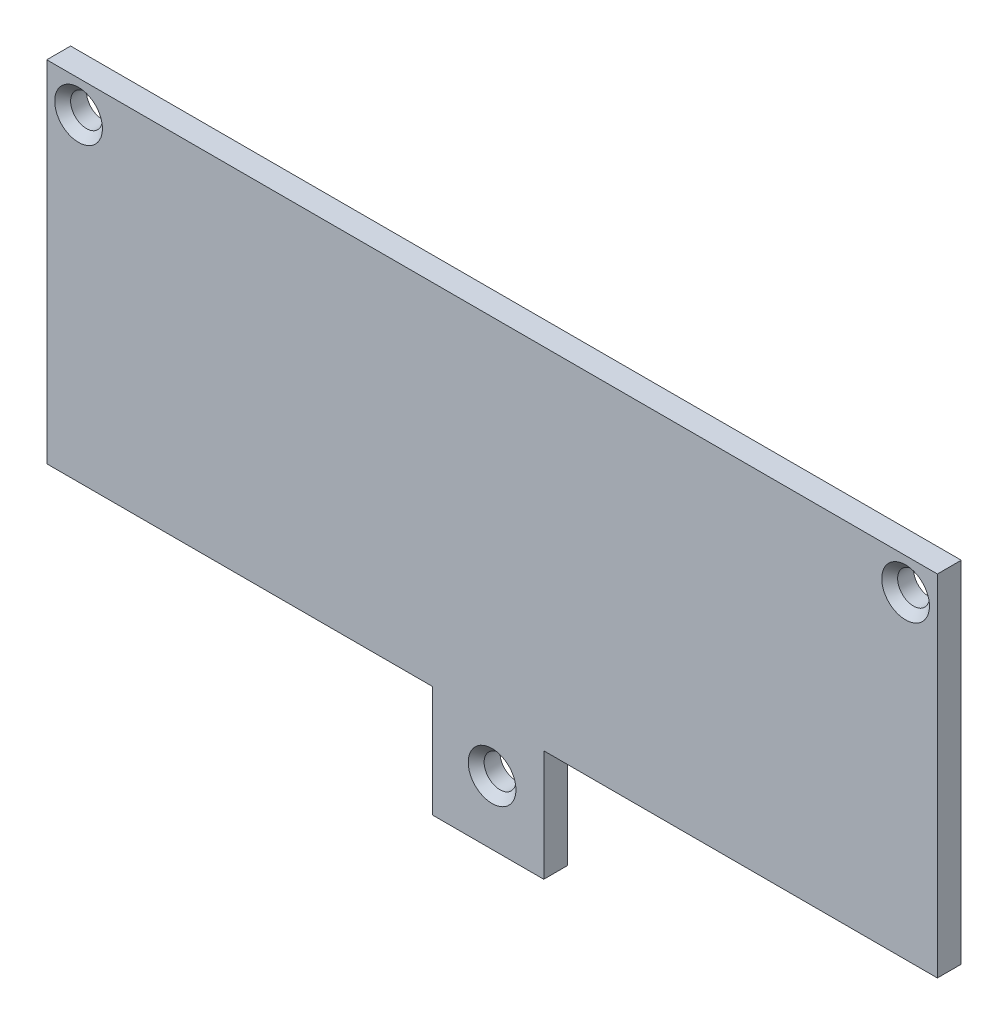
ISO-10303-21;
HEADER;
FILE_DESCRIPTION(('STEP AP214'),'2;1');
FILE_NAME('part.step','',(''),(''),'','','');
FILE_SCHEMA(('AUTOMOTIVE_DESIGN { 1 0 10303 214 1 1 1 1 }'));
ENDSEC;
DATA;
#1=APPLICATION_CONTEXT('core data for automotive mechanical design processes');
#2=APPLICATION_PROTOCOL_DEFINITION('international standard','automotive_design',2000,#1);
#3=PRODUCT_CONTEXT('',#1,'mechanical');
#4=PRODUCT('Part','Part','',(#3));
#5=PRODUCT_RELATED_PRODUCT_CATEGORY('part','',(#4));
#6=PRODUCT_DEFINITION_FORMATION('','',#4);
#7=PRODUCT_DEFINITION_CONTEXT('part definition',#1,'design');
#8=PRODUCT_DEFINITION('design','',#6,#7);
#9=PRODUCT_DEFINITION_SHAPE('','',#8);
#10=(LENGTH_UNIT() NAMED_UNIT(*) SI_UNIT(.MILLI.,.METRE.));
#11=(NAMED_UNIT(*) PLANE_ANGLE_UNIT() SI_UNIT($,.RADIAN.));
#12=(NAMED_UNIT(*) SI_UNIT($,.STERADIAN.) SOLID_ANGLE_UNIT());
#13=UNCERTAINTY_MEASURE_WITH_UNIT(LENGTH_MEASURE(1.E-05),#10,'distance_accuracy_value','');
#14=(GEOMETRIC_REPRESENTATION_CONTEXT(3) GLOBAL_UNCERTAINTY_ASSIGNED_CONTEXT((#13)) GLOBAL_UNIT_ASSIGNED_CONTEXT((#10,
#11,#12)) REPRESENTATION_CONTEXT('',''));
#15=CARTESIAN_POINT('',(0.,0.,0.));
#16=DIRECTION('',(0.,0.,1.));
#17=DIRECTION('',(1.,0.,0.));
#18=AXIS2_PLACEMENT_3D('',#15,#16,#17);
#19=CARTESIAN_POINT('',(0.,0.,1.5));
#20=DIRECTION('',(0.,1.,0.));
#21=DIRECTION('',(-1.,0.,0.));
#22=AXIS2_PLACEMENT_3D('',#19,#20,#21);
#23=PLANE('',#22);
#24=DIRECTION('',(1.,0.,0.));
#25=VECTOR('',#24,1.);
#26=CARTESIAN_POINT('',(0.,0.,1.5));
#27=LINE('',#26,#25);
#28=CARTESIAN_POINT('',(3.,0.,1.5));
#29=VERTEX_POINT('',#28);
#30=CARTESIAN_POINT('',(48.,0.,1.5));
#31=VERTEX_POINT('',#30);
#32=EDGE_CURVE('E226',#29,#31,#27,.T.);
#33=ORIENTED_EDGE('',*,*,#32,.F.);
#34=DIRECTION('',(0.,0.,-1.));
#35=VECTOR('',#34,1.);
#36=CARTESIAN_POINT('',(3.,0.,0.));
#37=LINE('',#36,#35);
#38=CARTESIAN_POINT('',(3.,0.,0.));
#39=VERTEX_POINT('',#38);
#40=EDGE_CURVE('E266',#29,#39,#37,.T.);
#41=ORIENTED_EDGE('',*,*,#40,.T.);
#42=DIRECTION('',(1.,0.,0.));
#43=VECTOR('',#42,1.);
#44=CARTESIAN_POINT('',(0.,0.,0.));
#45=LINE('',#44,#43);
#46=CARTESIAN_POINT('',(48.,0.,0.));
#47=VERTEX_POINT('',#46);
#48=EDGE_CURVE('E170',#39,#47,#45,.T.);
#49=ORIENTED_EDGE('',*,*,#48,.T.);
#50=DIRECTION('',(0.,0.,-1.));
#51=VECTOR('',#50,1.);
#52=CARTESIAN_POINT('',(48.,0.,1.5));
#53=LINE('',#52,#51);
#54=EDGE_CURVE('E264',#47,#31,#53,.F.);
#55=ORIENTED_EDGE('',*,*,#54,.T.);
#56=EDGE_LOOP('',(#33,#41,#49,#55));
#57=FACE_BOUND('',#56,.T.);
#58=ADVANCED_FACE('F37',(#57),#23,.F.);
#59=CARTESIAN_POINT('',(51.,0.,1.5));
#60=DIRECTION('',(-1.,0.,0.));
#61=DIRECTION('',(0.,-1.,0.));
#62=AXIS2_PLACEMENT_3D('',#59,#60,#61);
#63=PLANE('',#62);
#64=DIRECTION('',(0.,1.,0.));
#65=VECTOR('',#64,1.);
#66=CARTESIAN_POINT('',(51.,0.,1.5));
#67=LINE('',#66,#65);
#68=CARTESIAN_POINT('',(51.,3.,1.5));
#69=VERTEX_POINT('',#68);
#70=CARTESIAN_POINT('',(51.,13.,1.5));
#71=VERTEX_POINT('',#70);
#72=EDGE_CURVE('E228',#69,#71,#67,.T.);
#73=ORIENTED_EDGE('',*,*,#72,.F.);
#74=DIRECTION('',(0.,0.,-1.));
#75=VECTOR('',#74,1.);
#76=CARTESIAN_POINT('',(51.,3.,1.5));
#77=LINE('',#76,#75);
#78=CARTESIAN_POINT('',(51.,3.,0.));
#79=VERTEX_POINT('',#78);
#80=EDGE_CURVE('E270',#69,#79,#77,.T.);
#81=ORIENTED_EDGE('',*,*,#80,.T.);
#82=DIRECTION('',(0.,1.,0.));
#83=VECTOR('',#82,1.);
#84=CARTESIAN_POINT('',(51.,0.,0.));
#85=LINE('',#84,#83);
#86=CARTESIAN_POINT('',(51.,13.,0.));
#87=VERTEX_POINT('',#86);
#88=EDGE_CURVE('E240',#79,#87,#85,.T.);
#89=ORIENTED_EDGE('',*,*,#88,.T.);
#90=DIRECTION('',(0.,0.,-1.));
#91=VECTOR('',#90,1.);
#92=CARTESIAN_POINT('',(51.,13.,1.5));
#93=LINE('',#92,#91);
#94=EDGE_CURVE('E54',#87,#71,#93,.F.);
#95=ORIENTED_EDGE('',*,*,#94,.T.);
#96=EDGE_LOOP('',(#73,#81,#89,#95));
#97=FACE_BOUND('',#96,.T.);
#98=ADVANCED_FACE('F329',(#97),#63,.F.);
#99=CARTESIAN_POINT('',(0.,16.,1.5));
#100=DIRECTION('',(0.,1.,0.));
#101=DIRECTION('',(-1.,0.,0.));
#102=AXIS2_PLACEMENT_3D('',#99,#100,#101);
#103=PLANE('',#102);
#104=DIRECTION('',(1.,0.,0.));
#105=VECTOR('',#104,1.);
#106=CARTESIAN_POINT('',(0.,16.,0.));
#107=LINE('',#106,#105);
#108=CARTESIAN_POINT('',(3.00000000000001,16.,0.));
#109=VERTEX_POINT('',#108);
#110=CARTESIAN_POINT('',(48.,16.,0.));
#111=VERTEX_POINT('',#110);
#112=EDGE_CURVE('E242',#109,#111,#107,.T.);
#113=ORIENTED_EDGE('',*,*,#112,.F.);
#114=DIRECTION('',(0.,0.,-1.));
#115=VECTOR('',#114,1.);
#116=CARTESIAN_POINT('',(3.00000000000001,16.,1.5));
#117=LINE('',#116,#115);
#118=CARTESIAN_POINT('',(3.00000000000001,16.,1.5));
#119=VERTEX_POINT('',#118);
#120=EDGE_CURVE('E262',#109,#119,#117,.F.);
#121=ORIENTED_EDGE('',*,*,#120,.T.);
#122=DIRECTION('',(1.,0.,0.));
#123=VECTOR('',#122,1.);
#124=CARTESIAN_POINT('',(0.,16.,1.5));
#125=LINE('',#124,#123);
#126=CARTESIAN_POINT('',(48.,16.,1.5));
#127=VERTEX_POINT('',#126);
#128=EDGE_CURVE('E231',#119,#127,#125,.T.);
#129=ORIENTED_EDGE('',*,*,#128,.T.);
#130=DIRECTION('',(0.,0.,-1.));
#131=VECTOR('',#130,1.);
#132=CARTESIAN_POINT('',(48.,16.,0.));
#133=LINE('',#132,#131);
#134=EDGE_CURVE('E259',#127,#111,#133,.T.);
#135=ORIENTED_EDGE('',*,*,#134,.T.);
#136=EDGE_LOOP('',(#113,#121,#129,#135));
#137=FACE_BOUND('',#136,.T.);
#138=ADVANCED_FACE('F335',(#137),#103,.T.);
#139=CARTESIAN_POINT('',(0.,0.,1.5));
#140=DIRECTION('',(-1.,0.,0.));
#141=DIRECTION('',(0.,-1.,0.));
#142=AXIS2_PLACEMENT_3D('',#139,#140,#141);
#143=PLANE('',#142);
#144=DIRECTION('',(0.,1.,0.));
#145=VECTOR('',#144,1.);
#146=CARTESIAN_POINT('',(0.,0.,1.5));
#147=LINE('',#146,#145);
#148=CARTESIAN_POINT('',(0.,3.,1.5));
#149=VERTEX_POINT('',#148);
#150=CARTESIAN_POINT('',(0.,13.,1.5));
#151=VERTEX_POINT('',#150);
#152=EDGE_CURVE('E234',#149,#151,#147,.T.);
#153=ORIENTED_EDGE('',*,*,#152,.T.);
#154=DIRECTION('',(0.,0.,-1.));
#155=VECTOR('',#154,1.);
#156=CARTESIAN_POINT('',(0.,13.,1.5));
#157=LINE('',#156,#155);
#158=CARTESIAN_POINT('',(0.,13.,0.));
#159=VERTEX_POINT('',#158);
#160=EDGE_CURVE('E248',#151,#159,#157,.T.);
#161=ORIENTED_EDGE('',*,*,#160,.T.);
#162=DIRECTION('',(0.,1.,0.));
#163=VECTOR('',#162,1.);
#164=CARTESIAN_POINT('',(0.,0.,0.));
#165=LINE('',#164,#163);
#166=CARTESIAN_POINT('',(0.,3.,0.));
#167=VERTEX_POINT('',#166);
#168=EDGE_CURVE('E229',#167,#159,#165,.T.);
#169=ORIENTED_EDGE('',*,*,#168,.F.);
#170=DIRECTION('',(0.,0.,-1.));
#171=VECTOR('',#170,1.);
#172=CARTESIAN_POINT('',(0.,3.,1.5));
#173=LINE('',#172,#171);
#174=EDGE_CURVE('E237',#167,#149,#173,.F.);
#175=ORIENTED_EDGE('',*,*,#174,.T.);
#176=EDGE_LOOP('',(#153,#161,#169,#175));
#177=FACE_BOUND('',#176,.T.);
#178=ADVANCED_FACE('F367',(#177),#143,.T.);
#179=CARTESIAN_POINT('',(0.,0.,0.));
#180=DIRECTION('',(0.,0.,1.));
#181=DIRECTION('',(1.,0.,0.));
#182=AXIS2_PLACEMENT_3D('',#179,#180,#181);
#183=PLANE('',#182);
#184=ORIENTED_EDGE('',*,*,#168,.T.);
#185=CARTESIAN_POINT('',(3.00000000000001,13.,0.));
#186=DIRECTION('',(0.,0.,1.));
#187=DIRECTION('',(1.,0.,0.));
#188=AXIS2_PLACEMENT_3D('',#185,#186,#187);
#189=CIRCLE('',#188,3.);
#190=EDGE_CURVE('E257',#159,#109,#189,.F.);
#191=ORIENTED_EDGE('',*,*,#190,.T.);
#192=ORIENTED_EDGE('',*,*,#112,.T.);
#193=CARTESIAN_POINT('',(48.,13.,0.));
#194=DIRECTION('',(0.,0.,1.));
#195=DIRECTION('',(1.,0.,0.));
#196=AXIS2_PLACEMENT_3D('',#193,#194,#195);
#197=CIRCLE('',#196,3.);
#198=EDGE_CURVE('E251',#111,#87,#197,.F.);
#199=ORIENTED_EDGE('',*,*,#198,.T.);
#200=ORIENTED_EDGE('',*,*,#88,.F.);
#201=CARTESIAN_POINT('',(48.,3.00000000000001,0.));
#202=DIRECTION('',(0.,0.,1.));
#203=DIRECTION('',(1.,0.,0.));
#204=AXIS2_PLACEMENT_3D('',#201,#202,#203);
#205=CIRCLE('',#204,3.);
#206=EDGE_CURVE('E253',#79,#47,#205,.F.);
#207=ORIENTED_EDGE('',*,*,#206,.T.);
#208=ORIENTED_EDGE('',*,*,#48,.F.);
#209=CARTESIAN_POINT('',(3.,3.,0.));
#210=DIRECTION('',(0.,0.,1.));
#211=DIRECTION('',(1.,0.,0.));
#212=AXIS2_PLACEMENT_3D('',#209,#210,#211);
#213=CIRCLE('',#212,3.);
#214=EDGE_CURVE('E255',#39,#167,#213,.F.);
#215=ORIENTED_EDGE('',*,*,#214,.T.);
#216=EDGE_LOOP('',(#184,#191,#192,#199,#200,#207,#208,#215));
#217=FACE_BOUND('',#216,.T.);
#218=ADVANCED_FACE('F353',(#217),#183,.F.);
#219=CARTESIAN_POINT('',(0.,0.,1.5));
#220=DIRECTION('',(0.,0.,1.));
#221=DIRECTION('',(1.,0.,0.));
#222=AXIS2_PLACEMENT_3D('',#219,#220,#221);
#223=PLANE('',#222);
#224=CARTESIAN_POINT('',(25.5,-5.,1.5));
#225=DIRECTION('',(0.,0.,1.));
#226=DIRECTION('',(1.,0.,0.));
#227=AXIS2_PLACEMENT_3D('',#224,#225,#226);
#228=CIRCLE('',#227,0.999999999999999);
#229=CARTESIAN_POINT('',(26.5,-5.,1.5));
#230=VERTEX_POINT('',#229);
#231=EDGE_CURVE('E41',#230,#230,#228,.T.);
#232=ORIENTED_EDGE('',*,*,#231,.T.);
#233=EDGE_LOOP('',(#232));
#234=FACE_BOUND('',#233,.T.);
#235=CARTESIAN_POINT('',(-0.5,18.,1.5));
#236=DIRECTION('',(0.,0.,1.));
#237=DIRECTION('',(1.,0.,0.));
#238=AXIS2_PLACEMENT_3D('',#235,#236,#237);
#239=CIRCLE('',#238,0.999999999999999);
#240=CARTESIAN_POINT('',(0.499999999999999,18.,1.5));
#241=VERTEX_POINT('',#240);
#242=EDGE_CURVE('E280',#241,#241,#239,.T.);
#243=ORIENTED_EDGE('',*,*,#242,.T.);
#244=EDGE_LOOP('',(#243));
#245=FACE_BOUND('',#244,.T.);
#246=CARTESIAN_POINT('',(51.5,18.,1.5));
#247=DIRECTION('',(0.,0.,1.));
#248=DIRECTION('',(1.,0.,0.));
#249=AXIS2_PLACEMENT_3D('',#246,#247,#248);
#250=CIRCLE('',#249,1.);
#251=CARTESIAN_POINT('',(52.5,18.,1.5));
#252=VERTEX_POINT('',#251);
#253=EDGE_CURVE('E193',#252,#252,#250,.T.);
#254=ORIENTED_EDGE('',*,*,#253,.T.);
#255=EDGE_LOOP('',(#254));
#256=FACE_BOUND('',#255,.T.);
#257=DIRECTION('',(0.,-1.,0.));
#258=VECTOR('',#257,1.);
#259=CARTESIAN_POINT('',(-2.5,19.5,1.5));
#260=LINE('',#259,#258);
#261=CARTESIAN_POINT('',(-2.5,20.,1.5));
#262=VERTEX_POINT('',#261);
#263=CARTESIAN_POINT('',(-2.5,-2.,1.5));
#264=VERTEX_POINT('',#263);
#265=EDGE_CURVE('E167',#262,#264,#260,.T.);
#266=ORIENTED_EDGE('',*,*,#265,.F.);
#267=DIRECTION('',(-1.,0.,0.));
#268=VECTOR('',#267,1.);
#269=CARTESIAN_POINT('',(3.5,20.,1.5));
#270=LINE('',#269,#268);
#271=CARTESIAN_POINT('',(53.5,20.,1.5));
#272=VERTEX_POINT('',#271);
#273=EDGE_CURVE('E162',#272,#262,#270,.T.);
#274=ORIENTED_EDGE('',*,*,#273,.F.);
#275=DIRECTION('',(0.,1.,0.));
#276=VECTOR('',#275,1.);
#277=CARTESIAN_POINT('',(53.5,19.5,1.5));
#278=LINE('',#277,#276);
#279=CARTESIAN_POINT('',(53.5,-2.,1.5));
#280=VERTEX_POINT('',#279);
#281=EDGE_CURVE('E204',#280,#272,#278,.T.);
#282=ORIENTED_EDGE('',*,*,#281,.F.);
#283=DIRECTION('',(1.,0.,0.));
#284=VECTOR('',#283,1.);
#285=CARTESIAN_POINT('',(28.75,-2.,1.5));
#286=LINE('',#285,#284);
#287=CARTESIAN_POINT('',(28.75,-2.,1.5));
#288=VERTEX_POINT('',#287);
#289=EDGE_CURVE('E201',#288,#280,#286,.T.);
#290=ORIENTED_EDGE('',*,*,#289,.F.);
#291=DIRECTION('',(0.,1.,0.));
#292=VECTOR('',#291,1.);
#293=CARTESIAN_POINT('',(28.75,-2.,1.5));
#294=LINE('',#293,#292);
#295=CARTESIAN_POINT('',(28.75,-9.,1.5));
#296=VERTEX_POINT('',#295);
#297=EDGE_CURVE('E199',#296,#288,#294,.T.);
#298=ORIENTED_EDGE('',*,*,#297,.F.);
#299=DIRECTION('',(1.,0.,0.));
#300=VECTOR('',#299,1.);
#301=CARTESIAN_POINT('',(21.75,-9.,1.5));
#302=LINE('',#301,#300);
#303=CARTESIAN_POINT('',(21.75,-9.,1.5));
#304=VERTEX_POINT('',#303);
#305=EDGE_CURVE('E197',#304,#296,#302,.T.);
#306=ORIENTED_EDGE('',*,*,#305,.F.);
#307=DIRECTION('',(0.,-1.,0.));
#308=VECTOR('',#307,1.);
#309=CARTESIAN_POINT('',(21.75,-2.,1.5));
#310=LINE('',#309,#308);
#311=CARTESIAN_POINT('',(21.75,-2.,1.5));
#312=VERTEX_POINT('',#311);
#313=EDGE_CURVE('E195',#312,#304,#310,.T.);
#314=ORIENTED_EDGE('',*,*,#313,.F.);
#315=DIRECTION('',(1.,0.,0.));
#316=VECTOR('',#315,1.);
#317=CARTESIAN_POINT('',(-2.5,-2.,1.5));
#318=LINE('',#317,#316);
#319=EDGE_CURVE('E192',#264,#312,#318,.T.);
#320=ORIENTED_EDGE('',*,*,#319,.F.);
#321=EDGE_LOOP('',(#266,#274,#282,#290,#298,#306,#314,#320));
#322=FACE_BOUND('',#321,.T.);
#323=ORIENTED_EDGE('',*,*,#152,.F.);
#324=CARTESIAN_POINT('',(3.,3.,1.5));
#325=DIRECTION('',(0.,0.,1.));
#326=DIRECTION('',(1.,0.,0.));
#327=AXIS2_PLACEMENT_3D('',#324,#325,#326);
#328=CIRCLE('',#327,3.);
#329=EDGE_CURVE('E275',#149,#29,#328,.T.);
#330=ORIENTED_EDGE('',*,*,#329,.T.);
#331=ORIENTED_EDGE('',*,*,#32,.T.);
#332=CARTESIAN_POINT('',(48.,3.00000000000001,1.5));
#333=DIRECTION('',(0.,0.,1.));
#334=DIRECTION('',(1.,0.,0.));
#335=AXIS2_PLACEMENT_3D('',#332,#333,#334);
#336=CIRCLE('',#335,3.);
#337=EDGE_CURVE('E46',#31,#69,#336,.T.);
#338=ORIENTED_EDGE('',*,*,#337,.T.);
#339=ORIENTED_EDGE('',*,*,#72,.T.);
#340=CARTESIAN_POINT('',(48.,13.,1.5));
#341=DIRECTION('',(0.,0.,1.));
#342=DIRECTION('',(1.,0.,0.));
#343=AXIS2_PLACEMENT_3D('',#340,#341,#342);
#344=CIRCLE('',#343,3.);
#345=EDGE_CURVE('E11',#71,#127,#344,.T.);
#346=ORIENTED_EDGE('',*,*,#345,.T.);
#347=ORIENTED_EDGE('',*,*,#128,.F.);
#348=CARTESIAN_POINT('',(3.00000000000001,13.,1.5));
#349=DIRECTION('',(0.,0.,1.));
#350=DIRECTION('',(1.,0.,0.));
#351=AXIS2_PLACEMENT_3D('',#348,#349,#350);
#352=CIRCLE('',#351,3.);
#353=EDGE_CURVE('E273',#119,#151,#352,.T.);
#354=ORIENTED_EDGE('',*,*,#353,.T.);
#355=EDGE_LOOP('',(#323,#330,#331,#338,#339,#346,#347,#354));
#356=FACE_BOUND('',#355,.T.);
#357=ADVANCED_FACE('F363',(#234,#245,#256,#322,#356),#223,.F.);
#358=CARTESIAN_POINT('',(-2.5,19.5,3.));
#359=DIRECTION('',(1.,0.,0.));
#360=DIRECTION('',(0.,1.,0.));
#361=AXIS2_PLACEMENT_3D('',#358,#359,#360);
#362=PLANE('',#361);
#363=ORIENTED_EDGE('',*,*,#265,.T.);
#364=DIRECTION('',(0.,0.,-1.));
#365=VECTOR('',#364,1.);
#366=CARTESIAN_POINT('',(-2.5,-2.,3.));
#367=LINE('',#366,#365);
#368=CARTESIAN_POINT('',(-2.5,-2.,3.));
#369=VERTEX_POINT('',#368);
#370=EDGE_CURVE('E165',#369,#264,#367,.T.);
#371=ORIENTED_EDGE('',*,*,#370,.F.);
#372=DIRECTION('',(0.,-1.,0.));
#373=VECTOR('',#372,1.);
#374=CARTESIAN_POINT('',(-2.5,19.5,3.));
#375=LINE('',#374,#373);
#376=CARTESIAN_POINT('',(-2.5,20.,3.));
#377=VERTEX_POINT('',#376);
#378=EDGE_CURVE('E151',#377,#369,#375,.T.);
#379=ORIENTED_EDGE('',*,*,#378,.F.);
#380=DIRECTION('',(0.,0.,-1.));
#381=VECTOR('',#380,1.);
#382=CARTESIAN_POINT('',(-2.5,20.,3.));
#383=LINE('',#382,#381);
#384=EDGE_CURVE('E190',#377,#262,#383,.T.);
#385=ORIENTED_EDGE('',*,*,#384,.T.);
#386=EDGE_LOOP('',(#363,#371,#379,#385));
#387=FACE_BOUND('',#386,.T.);
#388=ADVANCED_FACE('F166',(#387),#362,.F.);
#389=CARTESIAN_POINT('',(-2.5,-2.,3.));
#390=DIRECTION('',(0.,1.,0.));
#391=DIRECTION('',(0.,0.,1.));
#392=AXIS2_PLACEMENT_3D('',#389,#390,#391);
#393=PLANE('',#392);
#394=ORIENTED_EDGE('',*,*,#319,.T.);
#395=DIRECTION('',(0.,0.,-1.));
#396=VECTOR('',#395,1.);
#397=CARTESIAN_POINT('',(21.75,-2.,3.));
#398=LINE('',#397,#396);
#399=CARTESIAN_POINT('',(21.75,-2.,3.));
#400=VERTEX_POINT('',#399);
#401=EDGE_CURVE('E171',#400,#312,#398,.T.);
#402=ORIENTED_EDGE('',*,*,#401,.F.);
#403=DIRECTION('',(1.,0.,0.));
#404=VECTOR('',#403,1.);
#405=CARTESIAN_POINT('',(-2.5,-2.,3.));
#406=LINE('',#405,#404);
#407=EDGE_CURVE('E155',#369,#400,#406,.T.);
#408=ORIENTED_EDGE('',*,*,#407,.F.);
#409=ORIENTED_EDGE('',*,*,#370,.T.);
#410=EDGE_LOOP('',(#394,#402,#408,#409));
#411=FACE_BOUND('',#410,.T.);
#412=ADVANCED_FACE('F173',(#411),#393,.F.);
#413=CARTESIAN_POINT('',(21.75,-2.,3.));
#414=DIRECTION('',(1.,0.,0.));
#415=DIRECTION('',(0.,0.,-1.));
#416=AXIS2_PLACEMENT_3D('',#413,#414,#415);
#417=PLANE('',#416);
#418=ORIENTED_EDGE('',*,*,#313,.T.);
#419=DIRECTION('',(0.,0.,-1.));
#420=VECTOR('',#419,1.);
#421=CARTESIAN_POINT('',(21.75,-9.,3.));
#422=LINE('',#421,#420);
#423=CARTESIAN_POINT('',(21.75,-9.,3.));
#424=VERTEX_POINT('',#423);
#425=EDGE_CURVE('E222',#424,#304,#422,.T.);
#426=ORIENTED_EDGE('',*,*,#425,.F.);
#427=DIRECTION('',(0.,-1.,0.));
#428=VECTOR('',#427,1.);
#429=CARTESIAN_POINT('',(21.75,-2.,3.));
#430=LINE('',#429,#428);
#431=EDGE_CURVE('E176',#400,#424,#430,.T.);
#432=ORIENTED_EDGE('',*,*,#431,.F.);
#433=ORIENTED_EDGE('',*,*,#401,.T.);
#434=EDGE_LOOP('',(#418,#426,#432,#433));
#435=FACE_BOUND('',#434,.T.);
#436=ADVANCED_FACE('F383',(#435),#417,.F.);
#437=CARTESIAN_POINT('',(21.75,-9.,3.));
#438=DIRECTION('',(0.,1.,0.));
#439=DIRECTION('',(0.,0.,1.));
#440=AXIS2_PLACEMENT_3D('',#437,#438,#439);
#441=PLANE('',#440);
#442=ORIENTED_EDGE('',*,*,#305,.T.);
#443=DIRECTION('',(0.,0.,-1.));
#444=VECTOR('',#443,1.);
#445=CARTESIAN_POINT('',(28.75,-9.,3.));
#446=LINE('',#445,#444);
#447=CARTESIAN_POINT('',(28.75,-9.,3.));
#448=VERTEX_POINT('',#447);
#449=EDGE_CURVE('E219',#448,#296,#446,.T.);
#450=ORIENTED_EDGE('',*,*,#449,.F.);
#451=DIRECTION('',(1.,0.,0.));
#452=VECTOR('',#451,1.);
#453=CARTESIAN_POINT('',(21.75,-9.,3.));
#454=LINE('',#453,#452);
#455=EDGE_CURVE('E178',#424,#448,#454,.T.);
#456=ORIENTED_EDGE('',*,*,#455,.F.);
#457=ORIENTED_EDGE('',*,*,#425,.T.);
#458=EDGE_LOOP('',(#442,#450,#456,#457));
#459=FACE_BOUND('',#458,.T.);
#460=ADVANCED_FACE('F386',(#459),#441,.F.);
#461=CARTESIAN_POINT('',(28.75,-2.,3.));
#462=DIRECTION('',(-1.,0.,0.));
#463=DIRECTION('',(0.,0.,1.));
#464=AXIS2_PLACEMENT_3D('',#461,#462,#463);
#465=PLANE('',#464);
#466=ORIENTED_EDGE('',*,*,#297,.T.);
#467=DIRECTION('',(0.,0.,-1.));
#468=VECTOR('',#467,1.);
#469=CARTESIAN_POINT('',(28.75,-2.,3.));
#470=LINE('',#469,#468);
#471=CARTESIAN_POINT('',(28.75,-2.,3.));
#472=VERTEX_POINT('',#471);
#473=EDGE_CURVE('E216',#472,#288,#470,.T.);
#474=ORIENTED_EDGE('',*,*,#473,.F.);
#475=DIRECTION('',(0.,1.,0.));
#476=VECTOR('',#475,1.);
#477=CARTESIAN_POINT('',(28.75,-2.,3.));
#478=LINE('',#477,#476);
#479=EDGE_CURVE('E183',#448,#472,#478,.T.);
#480=ORIENTED_EDGE('',*,*,#479,.F.);
#481=ORIENTED_EDGE('',*,*,#449,.T.);
#482=EDGE_LOOP('',(#466,#474,#480,#481));
#483=FACE_BOUND('',#482,.T.);
#484=ADVANCED_FACE('F390',(#483),#465,.F.);
#485=CARTESIAN_POINT('',(28.75,-2.,3.));
#486=DIRECTION('',(0.,1.,0.));
#487=DIRECTION('',(0.,0.,1.));
#488=AXIS2_PLACEMENT_3D('',#485,#486,#487);
#489=PLANE('',#488);
#490=ORIENTED_EDGE('',*,*,#289,.T.);
#491=DIRECTION('',(0.,0.,-1.));
#492=VECTOR('',#491,1.);
#493=CARTESIAN_POINT('',(53.5,-2.,3.));
#494=LINE('',#493,#492);
#495=CARTESIAN_POINT('',(53.5,-2.,3.));
#496=VERTEX_POINT('',#495);
#497=EDGE_CURVE('E213',#496,#280,#494,.T.);
#498=ORIENTED_EDGE('',*,*,#497,.F.);
#499=DIRECTION('',(1.,0.,0.));
#500=VECTOR('',#499,1.);
#501=CARTESIAN_POINT('',(28.75,-2.,3.));
#502=LINE('',#501,#500);
#503=EDGE_CURVE('E185',#472,#496,#502,.T.);
#504=ORIENTED_EDGE('',*,*,#503,.F.);
#505=ORIENTED_EDGE('',*,*,#473,.T.);
#506=EDGE_LOOP('',(#490,#498,#504,#505));
#507=FACE_BOUND('',#506,.T.);
#508=ADVANCED_FACE('F394',(#507),#489,.F.);
#509=CARTESIAN_POINT('',(53.5,19.5,3.));
#510=DIRECTION('',(-1.,0.,0.));
#511=DIRECTION('',(0.,0.,1.));
#512=AXIS2_PLACEMENT_3D('',#509,#510,#511);
#513=PLANE('',#512);
#514=ORIENTED_EDGE('',*,*,#281,.T.);
#515=DIRECTION('',(0.,0.,-1.));
#516=VECTOR('',#515,1.);
#517=CARTESIAN_POINT('',(53.5,20.,3.));
#518=LINE('',#517,#516);
#519=CARTESIAN_POINT('',(53.5,20.,3.));
#520=VERTEX_POINT('',#519);
#521=EDGE_CURVE('E210',#520,#272,#518,.T.);
#522=ORIENTED_EDGE('',*,*,#521,.F.);
#523=DIRECTION('',(0.,1.,0.));
#524=VECTOR('',#523,1.);
#525=CARTESIAN_POINT('',(53.5,19.5,3.));
#526=LINE('',#525,#524);
#527=EDGE_CURVE('E187',#496,#520,#526,.T.);
#528=ORIENTED_EDGE('',*,*,#527,.F.);
#529=ORIENTED_EDGE('',*,*,#497,.T.);
#530=EDGE_LOOP('',(#514,#522,#528,#529));
#531=FACE_BOUND('',#530,.T.);
#532=ADVANCED_FACE('F321',(#531),#513,.F.);
#533=CARTESIAN_POINT('',(3.5,20.,3.));
#534=DIRECTION('',(0.,-1.,0.));
#535=DIRECTION('',(0.,0.,-1.));
#536=AXIS2_PLACEMENT_3D('',#533,#534,#535);
#537=PLANE('',#536);
#538=ORIENTED_EDGE('',*,*,#273,.T.);
#539=ORIENTED_EDGE('',*,*,#384,.F.);
#540=DIRECTION('',(-1.,0.,0.));
#541=VECTOR('',#540,1.);
#542=CARTESIAN_POINT('',(53.5,20.,3.));
#543=LINE('',#542,#541);
#544=EDGE_CURVE('E158',#520,#377,#543,.T.);
#545=ORIENTED_EDGE('',*,*,#544,.F.);
#546=ORIENTED_EDGE('',*,*,#521,.T.);
#547=EDGE_LOOP('',(#538,#539,#545,#546));
#548=FACE_BOUND('',#547,.T.);
#549=ADVANCED_FACE('F311',(#548),#537,.F.);
#550=CARTESIAN_POINT('',(0.,0.,3.));
#551=DIRECTION('',(0.,0.,1.));
#552=DIRECTION('',(1.,0.,0.));
#553=AXIS2_PLACEMENT_3D('',#550,#551,#552);
#554=PLANE('',#553);
#555=CARTESIAN_POINT('',(25.5,-5.,3.));
#556=DIRECTION('',(0.,0.,1.));
#557=DIRECTION('',(1.,0.,0.));
#558=AXIS2_PLACEMENT_3D('',#555,#556,#557);
#559=CIRCLE('',#558,1.5);
#560=CARTESIAN_POINT('',(27.,-5.,3.));
#561=VERTEX_POINT('',#560);
#562=EDGE_CURVE('E447',#561,#561,#559,.T.);
#563=ORIENTED_EDGE('',*,*,#562,.F.);
#564=EDGE_LOOP('',(#563));
#565=FACE_BOUND('',#564,.T.);
#566=CARTESIAN_POINT('',(-0.5,18.,3.));
#567=DIRECTION('',(0.,0.,1.));
#568=DIRECTION('',(1.,0.,0.));
#569=AXIS2_PLACEMENT_3D('',#566,#567,#568);
#570=CIRCLE('',#569,1.5);
#571=CARTESIAN_POINT('',(1.,18.,3.));
#572=VERTEX_POINT('',#571);
#573=EDGE_CURVE('E289',#572,#572,#570,.T.);
#574=ORIENTED_EDGE('',*,*,#573,.F.);
#575=EDGE_LOOP('',(#574));
#576=FACE_BOUND('',#575,.T.);
#577=CARTESIAN_POINT('',(51.5,18.,3.));
#578=DIRECTION('',(0.,0.,1.));
#579=DIRECTION('',(1.,0.,0.));
#580=AXIS2_PLACEMENT_3D('',#577,#578,#579);
#581=CIRCLE('',#580,1.5);
#582=CARTESIAN_POINT('',(53.,18.,3.));
#583=VERTEX_POINT('',#582);
#584=EDGE_CURVE('E282',#583,#583,#581,.T.);
#585=ORIENTED_EDGE('',*,*,#584,.F.);
#586=EDGE_LOOP('',(#585));
#587=FACE_BOUND('',#586,.T.);
#588=ORIENTED_EDGE('',*,*,#378,.T.);
#589=ORIENTED_EDGE('',*,*,#407,.T.);
#590=ORIENTED_EDGE('',*,*,#431,.T.);
#591=ORIENTED_EDGE('',*,*,#455,.T.);
#592=ORIENTED_EDGE('',*,*,#479,.T.);
#593=ORIENTED_EDGE('',*,*,#503,.T.);
#594=ORIENTED_EDGE('',*,*,#527,.T.);
#595=ORIENTED_EDGE('',*,*,#544,.T.);
#596=EDGE_LOOP('',(#588,#589,#590,#591,#592,#593,#594,#595));
#597=FACE_BOUND('',#596,.T.);
#598=ADVANCED_FACE('F153',(#565,#576,#587,#597),#554,.T.);
#599=CARTESIAN_POINT('',(3.00000000000001,13.,1.5));
#600=DIRECTION('',(0.,0.,-1.));
#601=DIRECTION('',(-1.,0.,0.));
#602=AXIS2_PLACEMENT_3D('',#599,#600,#601);
#603=CYLINDRICAL_SURFACE('',#602,3.);
#604=ORIENTED_EDGE('',*,*,#353,.F.);
#605=ORIENTED_EDGE('',*,*,#120,.F.);
#606=ORIENTED_EDGE('',*,*,#190,.F.);
#607=ORIENTED_EDGE('',*,*,#160,.F.);
#608=EDGE_LOOP('',(#604,#605,#606,#607));
#609=FACE_BOUND('',#608,.T.);
#610=ADVANCED_FACE('F310',(#609),#603,.T.);
#611=CARTESIAN_POINT('',(3.,3.,1.5));
#612=DIRECTION('',(0.,0.,1.));
#613=DIRECTION('',(1.,0.,0.));
#614=AXIS2_PLACEMENT_3D('',#611,#612,#613);
#615=CYLINDRICAL_SURFACE('',#614,3.);
#616=ORIENTED_EDGE('',*,*,#329,.F.);
#617=ORIENTED_EDGE('',*,*,#174,.F.);
#618=ORIENTED_EDGE('',*,*,#214,.F.);
#619=ORIENTED_EDGE('',*,*,#40,.F.);
#620=EDGE_LOOP('',(#616,#617,#618,#619));
#621=FACE_BOUND('',#620,.T.);
#622=ADVANCED_FACE('F318',(#621),#615,.T.);
#623=CARTESIAN_POINT('',(48.,3.00000000000001,1.5));
#624=DIRECTION('',(0.,0.,-1.));
#625=DIRECTION('',(-1.,0.,0.));
#626=AXIS2_PLACEMENT_3D('',#623,#624,#625);
#627=CYLINDRICAL_SURFACE('',#626,3.);
#628=ORIENTED_EDGE('',*,*,#337,.F.);
#629=ORIENTED_EDGE('',*,*,#54,.F.);
#630=ORIENTED_EDGE('',*,*,#206,.F.);
#631=ORIENTED_EDGE('',*,*,#80,.F.);
#632=EDGE_LOOP('',(#628,#629,#630,#631));
#633=FACE_BOUND('',#632,.T.);
#634=ADVANCED_FACE('F341',(#633),#627,.T.);
#635=CARTESIAN_POINT('',(48.,13.,1.5));
#636=DIRECTION('',(0.,0.,1.));
#637=DIRECTION('',(1.,0.,0.));
#638=AXIS2_PLACEMENT_3D('',#635,#636,#637);
#639=CYLINDRICAL_SURFACE('',#638,3.);
#640=ORIENTED_EDGE('',*,*,#345,.F.);
#641=ORIENTED_EDGE('',*,*,#94,.F.);
#642=ORIENTED_EDGE('',*,*,#198,.F.);
#643=ORIENTED_EDGE('',*,*,#134,.F.);
#644=EDGE_LOOP('',(#640,#641,#642,#643));
#645=FACE_BOUND('',#644,.T.);
#646=ADVANCED_FACE('F39',(#645),#639,.T.);
#647=CARTESIAN_POINT('',(51.5,18.,3.));
#648=DIRECTION('',(0.,0.,1.));
#649=DIRECTION('',(1.,0.,0.));
#650=AXIS2_PLACEMENT_3D('',#647,#648,#649);
#651=CYLINDRICAL_SURFACE('',#650,1.);
#652=CARTESIAN_POINT('',(51.5,18.,2.5));
#653=DIRECTION('',(0.,0.,1.));
#654=DIRECTION('',(1.,0.,0.));
#655=AXIS2_PLACEMENT_3D('',#652,#653,#654);
#656=CIRCLE('',#655,1.);
#657=CARTESIAN_POINT('',(52.5,18.,2.5));
#658=VERTEX_POINT('',#657);
#659=EDGE_CURVE('E279',#658,#658,#656,.T.);
#660=ORIENTED_EDGE('',*,*,#659,.T.);
#661=EDGE_LOOP('',(#660));
#662=FACE_BOUND('',#661,.T.);
#663=ORIENTED_EDGE('',*,*,#253,.F.);
#664=EDGE_LOOP('',(#663));
#665=FACE_BOUND('',#664,.T.);
#666=ADVANCED_FACE('F299',(#662,#665),#651,.F.);
#667=CARTESIAN_POINT('',(51.5,18.,3.));
#668=DIRECTION('',(0.,0.,1.));
#669=DIRECTION('',(1.,0.,0.));
#670=AXIS2_PLACEMENT_3D('',#667,#668,#669);
#671=CONICAL_SURFACE('',#670,1.5,0.785398163397449);
#672=ORIENTED_EDGE('',*,*,#659,.F.);
#673=EDGE_LOOP('',(#672));
#674=FACE_BOUND('',#673,.T.);
#675=ORIENTED_EDGE('',*,*,#584,.T.);
#676=EDGE_LOOP('',(#675));
#677=FACE_BOUND('',#676,.T.);
#678=ADVANCED_FACE('F302',(#674,#677),#671,.F.);
#679=CARTESIAN_POINT('',(-0.5,18.,3.));
#680=DIRECTION('',(0.,0.,1.));
#681=DIRECTION('',(1.,0.,0.));
#682=AXIS2_PLACEMENT_3D('',#679,#680,#681);
#683=CYLINDRICAL_SURFACE('',#682,0.999999999999999);
#684=CARTESIAN_POINT('',(-0.5,18.,2.5));
#685=DIRECTION('',(0.,0.,1.));
#686=DIRECTION('',(1.,0.,0.));
#687=AXIS2_PLACEMENT_3D('',#684,#685,#686);
#688=CIRCLE('',#687,1.);
#689=CARTESIAN_POINT('',(0.499999999999999,18.,2.5));
#690=VERTEX_POINT('',#689);
#691=EDGE_CURVE('E283',#690,#690,#688,.T.);
#692=ORIENTED_EDGE('',*,*,#691,.T.);
#693=EDGE_LOOP('',(#692));
#694=FACE_BOUND('',#693,.T.);
#695=ORIENTED_EDGE('',*,*,#242,.F.);
#696=EDGE_LOOP('',(#695));
#697=FACE_BOUND('',#696,.T.);
#698=ADVANCED_FACE('F305',(#694,#697),#683,.F.);
#699=CARTESIAN_POINT('',(-0.5,18.,3.));
#700=DIRECTION('',(0.,0.,1.));
#701=DIRECTION('',(1.,0.,0.));
#702=AXIS2_PLACEMENT_3D('',#699,#700,#701);
#703=CONICAL_SURFACE('',#702,1.5,0.785398163397449);
#704=ORIENTED_EDGE('',*,*,#691,.F.);
#705=EDGE_LOOP('',(#704));
#706=FACE_BOUND('',#705,.T.);
#707=ORIENTED_EDGE('',*,*,#573,.T.);
#708=EDGE_LOOP('',(#707));
#709=FACE_BOUND('',#708,.T.);
#710=ADVANCED_FACE('F429',(#706,#709),#703,.F.);
#711=CARTESIAN_POINT('',(25.5,-5.,3.));
#712=DIRECTION('',(0.,0.,1.));
#713=DIRECTION('',(1.,0.,0.));
#714=AXIS2_PLACEMENT_3D('',#711,#712,#713);
#715=CYLINDRICAL_SURFACE('',#714,0.999999999999999);
#716=CARTESIAN_POINT('',(25.5,-5.,2.5));
#717=DIRECTION('',(0.,0.,1.));
#718=DIRECTION('',(1.,0.,0.));
#719=AXIS2_PLACEMENT_3D('',#716,#717,#718);
#720=CIRCLE('',#719,1.);
#721=CARTESIAN_POINT('',(26.5,-5.,2.5));
#722=VERTEX_POINT('',#721);
#723=EDGE_CURVE('E445',#722,#722,#720,.T.);
#724=ORIENTED_EDGE('',*,*,#723,.T.);
#725=EDGE_LOOP('',(#724));
#726=FACE_BOUND('',#725,.T.);
#727=ORIENTED_EDGE('',*,*,#231,.F.);
#728=EDGE_LOOP('',(#727));
#729=FACE_BOUND('',#728,.T.);
#730=ADVANCED_FACE('F432',(#726,#729),#715,.F.);
#731=CARTESIAN_POINT('',(25.5,-5.,3.));
#732=DIRECTION('',(0.,0.,1.));
#733=DIRECTION('',(1.,0.,0.));
#734=AXIS2_PLACEMENT_3D('',#731,#732,#733);
#735=CONICAL_SURFACE('',#734,1.5,0.785398163397449);
#736=ORIENTED_EDGE('',*,*,#723,.F.);
#737=EDGE_LOOP('',(#736));
#738=FACE_BOUND('',#737,.T.);
#739=ORIENTED_EDGE('',*,*,#562,.T.);
#740=EDGE_LOOP('',(#739));
#741=FACE_BOUND('',#740,.T.);
#742=ADVANCED_FACE('F436',(#738,#741),#735,.F.);
#743=CLOSED_SHELL('',(#58,#98,#138,#178,#218,#357,#388,#412,#436,#460,#484,#508,#532,#549,#598,
#610,#622,#634,#646,#666,#678,#698,#710,#730,#742));
#744=MANIFOLD_SOLID_BREP('B2',#743);
#745=ADVANCED_BREP_SHAPE_REPRESENTATION('',(#18,#744),#14);
#746=SHAPE_DEFINITION_REPRESENTATION(#9,#745);
ENDSEC;
END-ISO-10303-21;
